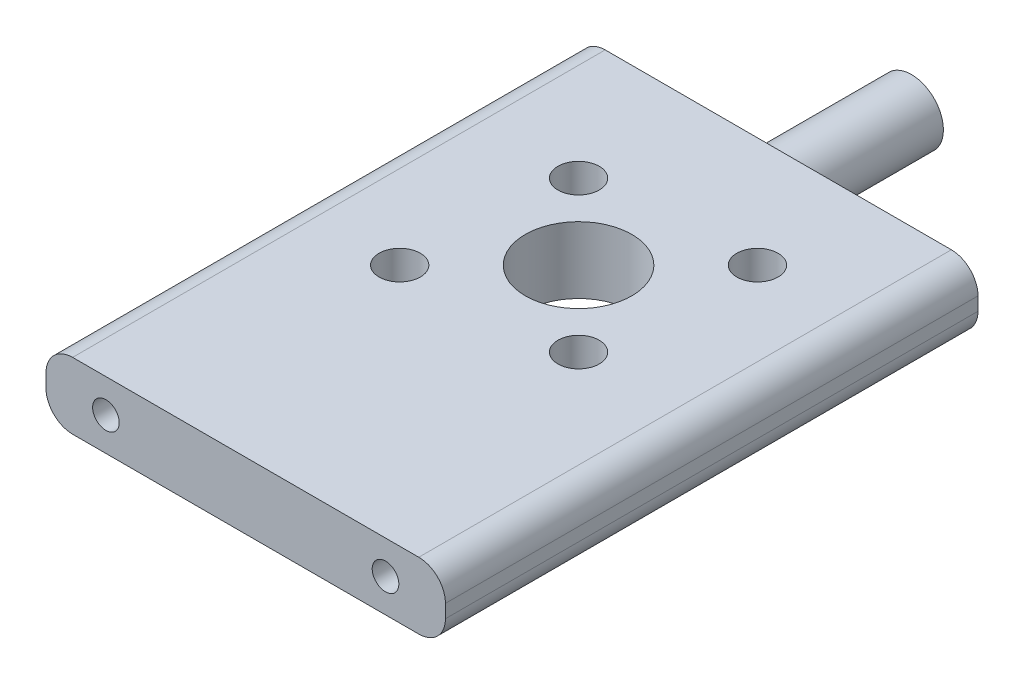
ISO-10303-21;
HEADER;
FILE_DESCRIPTION(('STEP AP214'),'2;1');
FILE_NAME('part.step','',(''),(''),'','','');
FILE_SCHEMA(('AUTOMOTIVE_DESIGN { 1 0 10303 214 1 1 1 1 }'));
ENDSEC;
DATA;
#1=APPLICATION_CONTEXT('core data for automotive mechanical design processes');
#2=APPLICATION_PROTOCOL_DEFINITION('international standard','automotive_design',2000,#1);
#3=PRODUCT_CONTEXT('',#1,'mechanical');
#4=PRODUCT('Part','Part','',(#3));
#5=PRODUCT_RELATED_PRODUCT_CATEGORY('part','',(#4));
#6=PRODUCT_DEFINITION_FORMATION('','',#4);
#7=PRODUCT_DEFINITION_CONTEXT('part definition',#1,'design');
#8=PRODUCT_DEFINITION('design','',#6,#7);
#9=PRODUCT_DEFINITION_SHAPE('','',#8);
#10=(LENGTH_UNIT() NAMED_UNIT(*) SI_UNIT(.MILLI.,.METRE.));
#11=(NAMED_UNIT(*) PLANE_ANGLE_UNIT() SI_UNIT($,.RADIAN.));
#12=(NAMED_UNIT(*) SI_UNIT($,.STERADIAN.) SOLID_ANGLE_UNIT());
#13=UNCERTAINTY_MEASURE_WITH_UNIT(LENGTH_MEASURE(1.E-05),#10,'distance_accuracy_value','');
#14=(GEOMETRIC_REPRESENTATION_CONTEXT(3) GLOBAL_UNCERTAINTY_ASSIGNED_CONTEXT((#13)) GLOBAL_UNIT_ASSIGNED_CONTEXT((#10,
#11,#12)) REPRESENTATION_CONTEXT('',''));
#15=CARTESIAN_POINT('',(0.,0.,0.));
#16=DIRECTION('',(0.,0.,1.));
#17=DIRECTION('',(1.,0.,0.));
#18=AXIS2_PLACEMENT_3D('',#15,#16,#17);
#19=CARTESIAN_POINT('',(22.6874179769715,5.,-26.1944918881506));
#20=DIRECTION('',(0.,0.,1.));
#21=DIRECTION('',(1.,0.,0.));
#22=AXIS2_PLACEMENT_3D('',#19,#20,#21);
#23=PLANE('',#22);
#24=DIRECTION('',(0.,-1.,0.));
#25=VECTOR('',#24,1.);
#26=CARTESIAN_POINT('',(22.6874179769715,5.,-26.1944918881506));
#27=LINE('',#26,#25);
#28=CARTESIAN_POINT('',(22.6874179769715,3.,-26.1944918881506));
#29=VERTEX_POINT('',#28);
#30=CARTESIAN_POINT('',(22.6874179769715,2.,-26.1944918881506));
#31=VERTEX_POINT('',#30);
#32=EDGE_CURVE('E103',#29,#31,#27,.T.);
#33=ORIENTED_EDGE('',*,*,#32,.T.);
#34=CARTESIAN_POINT('',(20.6874179769715,2.,-26.1944918881506));
#35=DIRECTION('',(0.,0.,1.));
#36=DIRECTION('',(1.,0.,0.));
#37=AXIS2_PLACEMENT_3D('',#34,#35,#36);
#38=CIRCLE('',#37,2.);
#39=CARTESIAN_POINT('',(20.6874179769715,0.,-26.1944918881506));
#40=VERTEX_POINT('',#39);
#41=EDGE_CURVE('E133',#31,#40,#38,.F.);
#42=ORIENTED_EDGE('',*,*,#41,.T.);
#43=DIRECTION('',(-1.,0.,0.));
#44=VECTOR('',#43,1.);
#45=CARTESIAN_POINT('',(22.6874179769715,0.,-26.1944918881506));
#46=LINE('',#45,#44);
#47=CARTESIAN_POINT('',(-5.31258202302848,0.,-26.1944918881506));
#48=VERTEX_POINT('',#47);
#49=EDGE_CURVE('E165',#40,#48,#46,.T.);
#50=ORIENTED_EDGE('',*,*,#49,.T.);
#51=CARTESIAN_POINT('',(-5.31258202302848,2.,-26.1944918881506));
#52=DIRECTION('',(0.,0.,1.));
#53=DIRECTION('',(1.,0.,0.));
#54=AXIS2_PLACEMENT_3D('',#51,#52,#53);
#55=CIRCLE('',#54,2.);
#56=CARTESIAN_POINT('',(-7.31258202302848,2.,-26.1944918881506));
#57=VERTEX_POINT('',#56);
#58=EDGE_CURVE('E109',#48,#57,#55,.F.);
#59=ORIENTED_EDGE('',*,*,#58,.T.);
#60=DIRECTION('',(0.,-1.,0.));
#61=VECTOR('',#60,1.);
#62=CARTESIAN_POINT('',(-7.31258202302848,5.,-26.1944918881506));
#63=LINE('',#62,#61);
#64=CARTESIAN_POINT('',(-7.31258202302848,3.,-26.1944918881506));
#65=VERTEX_POINT('',#64);
#66=EDGE_CURVE('E121',#65,#57,#63,.T.);
#67=ORIENTED_EDGE('',*,*,#66,.F.);
#68=CARTESIAN_POINT('',(-5.31258202302848,3.,-26.1944918881506));
#69=DIRECTION('',(0.,0.,1.));
#70=DIRECTION('',(1.,0.,0.));
#71=AXIS2_PLACEMENT_3D('',#68,#69,#70);
#72=CIRCLE('',#71,2.);
#73=CARTESIAN_POINT('',(-5.31258202302848,5.,-26.1944918881506));
#74=VERTEX_POINT('',#73);
#75=EDGE_CURVE('E110',#65,#74,#72,.F.);
#76=ORIENTED_EDGE('',*,*,#75,.T.);
#77=DIRECTION('',(-1.,0.,0.));
#78=VECTOR('',#77,1.);
#79=CARTESIAN_POINT('',(22.6874179769715,5.,-26.1944918881506));
#80=LINE('',#79,#78);
#81=CARTESIAN_POINT('',(20.6874179769715,5.,-26.1944918881506));
#82=VERTEX_POINT('',#81);
#83=EDGE_CURVE('E105',#82,#74,#80,.T.);
#84=ORIENTED_EDGE('',*,*,#83,.F.);
#85=CARTESIAN_POINT('',(20.6874179769715,3.,-26.1944918881506));
#86=DIRECTION('',(0.,0.,1.));
#87=DIRECTION('',(1.,0.,0.));
#88=AXIS2_PLACEMENT_3D('',#85,#86,#87);
#89=CIRCLE('',#88,2.);
#90=EDGE_CURVE('E100',#82,#29,#89,.F.);
#91=ORIENTED_EDGE('',*,*,#90,.T.);
#92=EDGE_LOOP('',(#33,#42,#50,#59,#67,#76,#84,#91));
#93=FACE_BOUND('',#92,.T.);
#94=CARTESIAN_POINT('',(7.68741797697152,2.5,-26.1944918881506));
#95=DIRECTION('',(0.,0.,1.));
#96=DIRECTION('',(1.,0.,0.));
#97=AXIS2_PLACEMENT_3D('',#94,#95,#96);
#98=CIRCLE('',#97,2.4);
#99=CARTESIAN_POINT('',(10.0874179769715,2.5,-26.1944918881506));
#100=VERTEX_POINT('',#99);
#101=EDGE_CURVE('E120',#100,#100,#98,.F.);
#102=ORIENTED_EDGE('',*,*,#101,.F.);
#103=EDGE_LOOP('',(#102));
#104=FACE_BOUND('',#103,.T.);
#105=ADVANCED_FACE('F33',(#93,#104),#23,.F.);
#106=CARTESIAN_POINT('',(22.6874179769715,5.,13.8055081118494));
#107=DIRECTION('',(-1.,0.,0.));
#108=DIRECTION('',(0.,0.,1.));
#109=AXIS2_PLACEMENT_3D('',#106,#107,#108);
#110=PLANE('',#109);
#111=DIRECTION('',(0.,-1.,0.));
#112=VECTOR('',#111,1.);
#113=CARTESIAN_POINT('',(22.6874179769715,5.,13.8055081118494));
#114=LINE('',#113,#112);
#115=CARTESIAN_POINT('',(22.6874179769715,3.,13.8055081118494));
#116=VERTEX_POINT('',#115);
#117=CARTESIAN_POINT('',(22.6874179769715,2.,13.8055081118494));
#118=VERTEX_POINT('',#117);
#119=EDGE_CURVE('E157',#116,#118,#114,.T.);
#120=ORIENTED_EDGE('',*,*,#119,.T.);
#121=DIRECTION('',(0.,0.,-1.));
#122=VECTOR('',#121,1.);
#123=CARTESIAN_POINT('',(22.6874179769715,2.,13.8055081118494));
#124=LINE('',#123,#122);
#125=EDGE_CURVE('E119',#118,#31,#124,.T.);
#126=ORIENTED_EDGE('',*,*,#125,.T.);
#127=ORIENTED_EDGE('',*,*,#32,.F.);
#128=DIRECTION('',(0.,0.,-1.));
#129=VECTOR('',#128,1.);
#130=CARTESIAN_POINT('',(22.6874179769715,3.,13.8055081118494));
#131=LINE('',#130,#129);
#132=EDGE_CURVE('E116',#29,#116,#131,.F.);
#133=ORIENTED_EDGE('',*,*,#132,.T.);
#134=EDGE_LOOP('',(#120,#126,#127,#133));
#135=FACE_BOUND('',#134,.T.);
#136=ADVANCED_FACE('F115',(#135),#110,.F.);
#137=CARTESIAN_POINT('',(-7.31258202302848,5.,13.8055081118494));
#138=DIRECTION('',(1.,0.,0.));
#139=DIRECTION('',(0.,0.,-1.));
#140=AXIS2_PLACEMENT_3D('',#137,#138,#139);
#141=PLANE('',#140);
#142=ORIENTED_EDGE('',*,*,#66,.T.);
#143=DIRECTION('',(0.,0.,1.));
#144=VECTOR('',#143,1.);
#145=CARTESIAN_POINT('',(-7.31258202302848,2.,13.8055081118494));
#146=LINE('',#145,#144);
#147=CARTESIAN_POINT('',(-7.31258202302848,2.,13.8055081118494));
#148=VERTEX_POINT('',#147);
#149=EDGE_CURVE('E146',#57,#148,#146,.T.);
#150=ORIENTED_EDGE('',*,*,#149,.T.);
#151=DIRECTION('',(0.,-1.,0.));
#152=VECTOR('',#151,1.);
#153=CARTESIAN_POINT('',(-7.31258202302848,5.,13.8055081118494));
#154=LINE('',#153,#152);
#155=CARTESIAN_POINT('',(-7.31258202302848,3.,13.8055081118494));
#156=VERTEX_POINT('',#155);
#157=EDGE_CURVE('E159',#156,#148,#154,.T.);
#158=ORIENTED_EDGE('',*,*,#157,.F.);
#159=DIRECTION('',(0.,0.,1.));
#160=VECTOR('',#159,1.);
#161=CARTESIAN_POINT('',(-7.31258202302848,3.,-26.1944918881506));
#162=LINE('',#161,#160);
#163=EDGE_CURVE('E144',#156,#65,#162,.F.);
#164=ORIENTED_EDGE('',*,*,#163,.T.);
#165=EDGE_LOOP('',(#142,#150,#158,#164));
#166=FACE_BOUND('',#165,.T.);
#167=ADVANCED_FACE('F174',(#166),#141,.F.);
#168=CARTESIAN_POINT('',(22.6874179769715,5.,13.8055081118494));
#169=DIRECTION('',(0.,0.,-1.));
#170=DIRECTION('',(-1.,0.,0.));
#171=AXIS2_PLACEMENT_3D('',#168,#169,#170);
#172=PLANE('',#171);
#173=CARTESIAN_POINT('',(18.1874179769715,2.5,13.8055081118494));
#174=DIRECTION('',(0.,0.,1.));
#175=DIRECTION('',(1.,0.,0.));
#176=AXIS2_PLACEMENT_3D('',#173,#174,#175);
#177=CIRCLE('',#176,1.);
#178=CARTESIAN_POINT('',(19.1874179769715,2.5,13.8055081118494));
#179=VERTEX_POINT('',#178);
#180=EDGE_CURVE('E380',#179,#179,#177,.T.);
#181=ORIENTED_EDGE('',*,*,#180,.F.);
#182=EDGE_LOOP('',(#181));
#183=FACE_BOUND('',#182,.T.);
#184=CARTESIAN_POINT('',(-2.81258202302848,2.5,13.8055081118494));
#185=DIRECTION('',(0.,0.,1.));
#186=DIRECTION('',(1.,0.,0.));
#187=AXIS2_PLACEMENT_3D('',#184,#185,#186);
#188=CIRCLE('',#187,1.);
#189=CARTESIAN_POINT('',(-1.81258202302848,2.5,13.8055081118494));
#190=VERTEX_POINT('',#189);
#191=EDGE_CURVE('E383',#190,#190,#188,.T.);
#192=ORIENTED_EDGE('',*,*,#191,.F.);
#193=EDGE_LOOP('',(#192));
#194=FACE_BOUND('',#193,.T.);
#195=DIRECTION('',(1.,0.,0.));
#196=VECTOR('',#195,1.);
#197=CARTESIAN_POINT('',(22.6874179769715,0.,13.8055081118494));
#198=LINE('',#197,#196);
#199=CARTESIAN_POINT('',(-5.31258202302848,0.,13.8055081118494));
#200=VERTEX_POINT('',#199);
#201=CARTESIAN_POINT('',(20.6874179769715,0.,13.8055081118494));
#202=VERTEX_POINT('',#201);
#203=EDGE_CURVE('E161',#200,#202,#198,.T.);
#204=ORIENTED_EDGE('',*,*,#203,.T.);
#205=CARTESIAN_POINT('',(20.6874179769715,2.,13.8055081118494));
#206=DIRECTION('',(0.,0.,-1.));
#207=DIRECTION('',(-1.,0.,0.));
#208=AXIS2_PLACEMENT_3D('',#205,#206,#207);
#209=CIRCLE('',#208,2.);
#210=EDGE_CURVE('E142',#202,#118,#209,.F.);
#211=ORIENTED_EDGE('',*,*,#210,.T.);
#212=ORIENTED_EDGE('',*,*,#119,.F.);
#213=CARTESIAN_POINT('',(20.6874179769715,3.,13.8055081118494));
#214=DIRECTION('',(0.,0.,-1.));
#215=DIRECTION('',(-1.,0.,0.));
#216=AXIS2_PLACEMENT_3D('',#213,#214,#215);
#217=CIRCLE('',#216,2.);
#218=CARTESIAN_POINT('',(20.6874179769715,5.,13.8055081118494));
#219=VERTEX_POINT('',#218);
#220=EDGE_CURVE('E125',#116,#219,#217,.F.);
#221=ORIENTED_EDGE('',*,*,#220,.T.);
#222=DIRECTION('',(1.,0.,0.));
#223=VECTOR('',#222,1.);
#224=CARTESIAN_POINT('',(22.6874179769715,5.,13.8055081118494));
#225=LINE('',#224,#223);
#226=CARTESIAN_POINT('',(-5.31258202302848,5.,13.8055081118494));
#227=VERTEX_POINT('',#226);
#228=EDGE_CURVE('E152',#227,#219,#225,.T.);
#229=ORIENTED_EDGE('',*,*,#228,.F.);
#230=CARTESIAN_POINT('',(-5.31258202302848,3.,13.8055081118494));
#231=DIRECTION('',(0.,0.,-1.));
#232=DIRECTION('',(-1.,0.,0.));
#233=AXIS2_PLACEMENT_3D('',#230,#231,#232);
#234=CIRCLE('',#233,2.);
#235=EDGE_CURVE('E56',#227,#156,#234,.F.);
#236=ORIENTED_EDGE('',*,*,#235,.T.);
#237=ORIENTED_EDGE('',*,*,#157,.T.);
#238=CARTESIAN_POINT('',(-5.31258202302848,2.,13.8055081118494));
#239=DIRECTION('',(0.,0.,-1.));
#240=DIRECTION('',(-1.,0.,0.));
#241=AXIS2_PLACEMENT_3D('',#238,#239,#240);
#242=CIRCLE('',#241,2.);
#243=EDGE_CURVE('E48',#148,#200,#242,.F.);
#244=ORIENTED_EDGE('',*,*,#243,.T.);
#245=EDGE_LOOP('',(#204,#211,#212,#221,#229,#236,#237,#244));
#246=FACE_BOUND('',#245,.T.);
#247=ADVANCED_FACE('F156',(#183,#194,#246),#172,.F.);
#248=CARTESIAN_POINT('',(0.,5.,0.));
#249=DIRECTION('',(0.,1.,0.));
#250=DIRECTION('',(0.,0.,1.));
#251=AXIS2_PLACEMENT_3D('',#248,#249,#250);
#252=PLANE('',#251);
#253=CARTESIAN_POINT('',(0.969903555699315,5.,-4.47697746687841));
#254=DIRECTION('',(0.,1.,0.));
#255=DIRECTION('',(0.,0.,1.));
#256=AXIS2_PLACEMENT_3D('',#253,#254,#255);
#257=CIRCLE('',#256,1.55);
#258=CARTESIAN_POINT('',(0.969903555699315,5.,-2.92697746687841));
#259=VERTEX_POINT('',#258);
#260=EDGE_CURVE('E389',#259,#259,#257,.T.);
#261=ORIENTED_EDGE('',*,*,#260,.F.);
#262=EDGE_LOOP('',(#261));
#263=FACE_BOUND('',#262,.T.);
#264=CARTESIAN_POINT('',(13.3442722264639,5.,-5.53763763865823));
#265=DIRECTION('',(0.,1.,0.));
#266=DIRECTION('',(0.,0.,1.));
#267=AXIS2_PLACEMENT_3D('',#264,#265,#266);
#268=CIRCLE('',#267,1.55);
#269=CARTESIAN_POINT('',(13.3442722264639,5.,-3.98763763865823));
#270=VERTEX_POINT('',#269);
#271=EDGE_CURVE('E398',#270,#270,#268,.T.);
#272=ORIENTED_EDGE('',*,*,#271,.F.);
#273=EDGE_LOOP('',(#272));
#274=FACE_BOUND('',#273,.T.);
#275=CARTESIAN_POINT('',(14.4049323982437,5.,-17.9120063094228));
#276=DIRECTION('',(0.,1.,0.));
#277=DIRECTION('',(0.,0.,1.));
#278=AXIS2_PLACEMENT_3D('',#275,#276,#277);
#279=CIRCLE('',#278,1.55);
#280=CARTESIAN_POINT('',(14.4049323982437,5.,-16.3620063094228));
#281=VERTEX_POINT('',#280);
#282=EDGE_CURVE('E404',#281,#281,#279,.T.);
#283=ORIENTED_EDGE('',*,*,#282,.F.);
#284=EDGE_LOOP('',(#283));
#285=FACE_BOUND('',#284,.T.);
#286=CARTESIAN_POINT('',(2.03056372747914,5.,-16.851346137643));
#287=DIRECTION('',(0.,1.,0.));
#288=DIRECTION('',(0.,0.,1.));
#289=AXIS2_PLACEMENT_3D('',#286,#287,#288);
#290=CIRCLE('',#289,1.55);
#291=CARTESIAN_POINT('',(2.03056372747914,5.,-15.301346137643));
#292=VERTEX_POINT('',#291);
#293=EDGE_CURVE('E410',#292,#292,#290,.T.);
#294=ORIENTED_EDGE('',*,*,#293,.F.);
#295=EDGE_LOOP('',(#294));
#296=FACE_BOUND('',#295,.T.);
#297=CARTESIAN_POINT('',(7.68741797697152,5.,-11.1944918881506));
#298=DIRECTION('',(0.,1.,0.));
#299=DIRECTION('',(0.,0.,1.));
#300=AXIS2_PLACEMENT_3D('',#297,#298,#299);
#301=CIRCLE('',#300,4.);
#302=CARTESIAN_POINT('',(7.68741797697152,5.,-7.19449188815061));
#303=VERTEX_POINT('',#302);
#304=EDGE_CURVE('E416',#303,#303,#301,.T.);
#305=ORIENTED_EDGE('',*,*,#304,.F.);
#306=EDGE_LOOP('',(#305));
#307=FACE_BOUND('',#306,.T.);
#308=ORIENTED_EDGE('',*,*,#228,.T.);
#309=DIRECTION('',(0.,0.,-1.));
#310=VECTOR('',#309,1.);
#311=CARTESIAN_POINT('',(20.6874179769715,5.,-26.1944918881506));
#312=LINE('',#311,#310);
#313=EDGE_CURVE('E11',#219,#82,#312,.T.);
#314=ORIENTED_EDGE('',*,*,#313,.T.);
#315=ORIENTED_EDGE('',*,*,#83,.T.);
#316=DIRECTION('',(0.,0.,1.));
#317=VECTOR('',#316,1.);
#318=CARTESIAN_POINT('',(-5.31258202302848,5.,13.8055081118494));
#319=LINE('',#318,#317);
#320=EDGE_CURVE('E41',#74,#227,#319,.T.);
#321=ORIENTED_EDGE('',*,*,#320,.T.);
#322=EDGE_LOOP('',(#308,#314,#315,#321));
#323=FACE_BOUND('',#322,.T.);
#324=ADVANCED_FACE('F151',(#263,#274,#285,#296,#307,#323),#252,.T.);
#325=CARTESIAN_POINT('',(0.,0.,0.));
#326=DIRECTION('',(0.,1.,0.));
#327=DIRECTION('',(0.,0.,1.));
#328=AXIS2_PLACEMENT_3D('',#325,#326,#327);
#329=PLANE('',#328);
#330=CARTESIAN_POINT('',(0.969903555699315,0.,-4.47697746687841));
#331=DIRECTION('',(0.,1.,0.));
#332=DIRECTION('',(0.,0.,1.));
#333=AXIS2_PLACEMENT_3D('',#330,#331,#332);
#334=CIRCLE('',#333,1.55);
#335=CARTESIAN_POINT('',(0.969903555699315,0.,-2.92697746687841));
#336=VERTEX_POINT('',#335);
#337=EDGE_CURVE('E395',#336,#336,#334,.T.);
#338=ORIENTED_EDGE('',*,*,#337,.T.);
#339=EDGE_LOOP('',(#338));
#340=FACE_BOUND('',#339,.T.);
#341=CARTESIAN_POINT('',(13.3442722264639,0.,-5.53763763865823));
#342=DIRECTION('',(0.,1.,0.));
#343=DIRECTION('',(0.,0.,1.));
#344=AXIS2_PLACEMENT_3D('',#341,#342,#343);
#345=CIRCLE('',#344,1.55);
#346=CARTESIAN_POINT('',(13.3442722264639,0.,-3.98763763865823));
#347=VERTEX_POINT('',#346);
#348=EDGE_CURVE('E401',#347,#347,#345,.T.);
#349=ORIENTED_EDGE('',*,*,#348,.T.);
#350=EDGE_LOOP('',(#349));
#351=FACE_BOUND('',#350,.T.);
#352=CARTESIAN_POINT('',(14.4049323982437,0.,-17.9120063094228));
#353=DIRECTION('',(0.,1.,0.));
#354=DIRECTION('',(0.,0.,1.));
#355=AXIS2_PLACEMENT_3D('',#352,#353,#354);
#356=CIRCLE('',#355,1.55);
#357=CARTESIAN_POINT('',(14.4049323982437,0.,-16.3620063094228));
#358=VERTEX_POINT('',#357);
#359=EDGE_CURVE('E407',#358,#358,#356,.T.);
#360=ORIENTED_EDGE('',*,*,#359,.T.);
#361=EDGE_LOOP('',(#360));
#362=FACE_BOUND('',#361,.T.);
#363=CARTESIAN_POINT('',(2.03056372747914,0.,-16.851346137643));
#364=DIRECTION('',(0.,1.,0.));
#365=DIRECTION('',(0.,0.,1.));
#366=AXIS2_PLACEMENT_3D('',#363,#364,#365);
#367=CIRCLE('',#366,1.55);
#368=CARTESIAN_POINT('',(2.03056372747914,0.,-15.301346137643));
#369=VERTEX_POINT('',#368);
#370=EDGE_CURVE('E413',#369,#369,#367,.T.);
#371=ORIENTED_EDGE('',*,*,#370,.T.);
#372=EDGE_LOOP('',(#371));
#373=FACE_BOUND('',#372,.T.);
#374=CARTESIAN_POINT('',(7.68741797697152,0.,-11.1944918881506));
#375=DIRECTION('',(0.,1.,0.));
#376=DIRECTION('',(0.,0.,1.));
#377=AXIS2_PLACEMENT_3D('',#374,#375,#376);
#378=CIRCLE('',#377,4.);
#379=CARTESIAN_POINT('',(7.68741797697152,0.,-7.19449188815061));
#380=VERTEX_POINT('',#379);
#381=EDGE_CURVE('E168',#380,#380,#378,.T.);
#382=ORIENTED_EDGE('',*,*,#381,.T.);
#383=EDGE_LOOP('',(#382));
#384=FACE_BOUND('',#383,.T.);
#385=ORIENTED_EDGE('',*,*,#49,.F.);
#386=DIRECTION('',(0.,0.,-1.));
#387=VECTOR('',#386,1.);
#388=CARTESIAN_POINT('',(20.6874179769715,0.,0.));
#389=LINE('',#388,#387);
#390=EDGE_CURVE('E137',#40,#202,#389,.F.);
#391=ORIENTED_EDGE('',*,*,#390,.T.);
#392=ORIENTED_EDGE('',*,*,#203,.F.);
#393=DIRECTION('',(0.,0.,1.));
#394=VECTOR('',#393,1.);
#395=CARTESIAN_POINT('',(-5.31258202302848,0.,0.));
#396=LINE('',#395,#394);
#397=EDGE_CURVE('E135',#200,#48,#396,.F.);
#398=ORIENTED_EDGE('',*,*,#397,.T.);
#399=EDGE_LOOP('',(#385,#391,#392,#398));
#400=FACE_BOUND('',#399,.T.);
#401=ADVANCED_FACE('F181',(#340,#351,#362,#373,#384,#400),#329,.F.);
#402=CARTESIAN_POINT('',(7.68741797697152,0.,-11.1944918881506));
#403=DIRECTION('',(0.,1.,0.));
#404=DIRECTION('',(0.,0.,1.));
#405=AXIS2_PLACEMENT_3D('',#402,#403,#404);
#406=CYLINDRICAL_SURFACE('',#405,4.);
#407=ORIENTED_EDGE('',*,*,#381,.F.);
#408=EDGE_LOOP('',(#407));
#409=FACE_BOUND('',#408,.T.);
#410=ORIENTED_EDGE('',*,*,#304,.T.);
#411=EDGE_LOOP('',(#410));
#412=FACE_BOUND('',#411,.T.);
#413=ADVANCED_FACE('F318',(#409,#412),#406,.F.);
#414=CARTESIAN_POINT('',(2.03056372747914,0.,-16.851346137643));
#415=DIRECTION('',(0.,1.,0.));
#416=DIRECTION('',(0.,0.,1.));
#417=AXIS2_PLACEMENT_3D('',#414,#415,#416);
#418=CYLINDRICAL_SURFACE('',#417,1.55);
#419=ORIENTED_EDGE('',*,*,#370,.F.);
#420=EDGE_LOOP('',(#419));
#421=FACE_BOUND('',#420,.T.);
#422=ORIENTED_EDGE('',*,*,#293,.T.);
#423=EDGE_LOOP('',(#422));
#424=FACE_BOUND('',#423,.T.);
#425=ADVANCED_FACE('F309',(#421,#424),#418,.F.);
#426=CARTESIAN_POINT('',(14.4049323982437,0.,-17.9120063094228));
#427=DIRECTION('',(0.,1.,0.));
#428=DIRECTION('',(0.,0.,1.));
#429=AXIS2_PLACEMENT_3D('',#426,#427,#428);
#430=CYLINDRICAL_SURFACE('',#429,1.55);
#431=ORIENTED_EDGE('',*,*,#359,.F.);
#432=EDGE_LOOP('',(#431));
#433=FACE_BOUND('',#432,.T.);
#434=ORIENTED_EDGE('',*,*,#282,.T.);
#435=EDGE_LOOP('',(#434));
#436=FACE_BOUND('',#435,.T.);
#437=ADVANCED_FACE('F300',(#433,#436),#430,.F.);
#438=CARTESIAN_POINT('',(13.3442722264639,0.,-5.53763763865823));
#439=DIRECTION('',(0.,1.,0.));
#440=DIRECTION('',(0.,0.,1.));
#441=AXIS2_PLACEMENT_3D('',#438,#439,#440);
#442=CYLINDRICAL_SURFACE('',#441,1.55);
#443=ORIENTED_EDGE('',*,*,#348,.F.);
#444=EDGE_LOOP('',(#443));
#445=FACE_BOUND('',#444,.T.);
#446=ORIENTED_EDGE('',*,*,#271,.T.);
#447=EDGE_LOOP('',(#446));
#448=FACE_BOUND('',#447,.T.);
#449=ADVANCED_FACE('F291',(#445,#448),#442,.F.);
#450=CARTESIAN_POINT('',(0.969903555699315,0.,-4.47697746687841));
#451=DIRECTION('',(0.,1.,0.));
#452=DIRECTION('',(0.,0.,1.));
#453=AXIS2_PLACEMENT_3D('',#450,#451,#452);
#454=CYLINDRICAL_SURFACE('',#453,1.55);
#455=ORIENTED_EDGE('',*,*,#337,.F.);
#456=EDGE_LOOP('',(#455));
#457=FACE_BOUND('',#456,.T.);
#458=ORIENTED_EDGE('',*,*,#260,.T.);
#459=EDGE_LOOP('',(#458));
#460=FACE_BOUND('',#459,.T.);
#461=ADVANCED_FACE('F282',(#457,#460),#454,.F.);
#462=CARTESIAN_POINT('',(-2.81258202302848,2.5,8.8055081118494));
#463=DIRECTION('',(0.,0.,1.));
#464=DIRECTION('',(1.,0.,0.));
#465=AXIS2_PLACEMENT_3D('',#462,#463,#464);
#466=CYLINDRICAL_SURFACE('',#465,1.);
#467=CARTESIAN_POINT('',(-2.81258202302848,2.5,8.8055081118494));
#468=DIRECTION('',(0.,0.,1.));
#469=DIRECTION('',(1.,0.,0.));
#470=AXIS2_PLACEMENT_3D('',#467,#468,#469);
#471=CIRCLE('',#470,1.);
#472=CARTESIAN_POINT('',(-1.81258202302848,2.5,8.8055081118494));
#473=VERTEX_POINT('',#472);
#474=EDGE_CURVE('E385',#473,#473,#471,.T.);
#475=ORIENTED_EDGE('',*,*,#474,.F.);
#476=EDGE_LOOP('',(#475));
#477=FACE_BOUND('',#476,.T.);
#478=ORIENTED_EDGE('',*,*,#191,.T.);
#479=EDGE_LOOP('',(#478));
#480=FACE_BOUND('',#479,.T.);
#481=ADVANCED_FACE('F273',(#477,#480),#466,.F.);
#482=CARTESIAN_POINT('',(-2.81258202302848,2.5,8.8055081118494));
#483=DIRECTION('',(0.,0.,1.));
#484=DIRECTION('',(1.,0.,0.));
#485=AXIS2_PLACEMENT_3D('',#482,#483,#484);
#486=PLANE('',#485);
#487=ORIENTED_EDGE('',*,*,#474,.T.);
#488=EDGE_LOOP('',(#487));
#489=FACE_BOUND('',#488,.T.);
#490=ADVANCED_FACE('F264',(#489),#486,.T.);
#491=CARTESIAN_POINT('',(18.1874179769715,2.5,8.8055081118494));
#492=DIRECTION('',(0.,0.,1.));
#493=DIRECTION('',(1.,0.,0.));
#494=AXIS2_PLACEMENT_3D('',#491,#492,#493);
#495=CYLINDRICAL_SURFACE('',#494,1.);
#496=CARTESIAN_POINT('',(18.1874179769715,2.5,8.8055081118494));
#497=DIRECTION('',(0.,0.,1.));
#498=DIRECTION('',(1.,0.,0.));
#499=AXIS2_PLACEMENT_3D('',#496,#497,#498);
#500=CIRCLE('',#499,1.);
#501=CARTESIAN_POINT('',(19.1874179769715,2.5,8.8055081118494));
#502=VERTEX_POINT('',#501);
#503=EDGE_CURVE('E386',#502,#502,#500,.T.);
#504=ORIENTED_EDGE('',*,*,#503,.F.);
#505=EDGE_LOOP('',(#504));
#506=FACE_BOUND('',#505,.T.);
#507=ORIENTED_EDGE('',*,*,#180,.T.);
#508=EDGE_LOOP('',(#507));
#509=FACE_BOUND('',#508,.T.);
#510=ADVANCED_FACE('F255',(#506,#509),#495,.F.);
#511=CARTESIAN_POINT('',(18.1874179769715,2.5,8.8055081118494));
#512=DIRECTION('',(0.,0.,1.));
#513=DIRECTION('',(1.,0.,0.));
#514=AXIS2_PLACEMENT_3D('',#511,#512,#513);
#515=PLANE('',#514);
#516=ORIENTED_EDGE('',*,*,#503,.T.);
#517=EDGE_LOOP('',(#516));
#518=FACE_BOUND('',#517,.T.);
#519=ADVANCED_FACE('F241',(#518),#515,.T.);
#520=CARTESIAN_POINT('',(7.68741797697152,2.5,-36.1944918881506));
#521=DIRECTION('',(0.,0.,1.));
#522=DIRECTION('',(1.,0.,0.));
#523=AXIS2_PLACEMENT_3D('',#520,#521,#522);
#524=CYLINDRICAL_SURFACE('',#523,2.4);
#525=CARTESIAN_POINT('',(7.68741797697152,2.5,-36.1944918881506));
#526=DIRECTION('',(0.,0.,-1.));
#527=DIRECTION('',(-1.,0.,0.));
#528=AXIS2_PLACEMENT_3D('',#525,#526,#527);
#529=CIRCLE('',#528,2.4);
#530=CARTESIAN_POINT('',(5.28741797697152,2.5,-36.1944918881506));
#531=VERTEX_POINT('',#530);
#532=EDGE_CURVE('E444',#531,#531,#529,.T.);
#533=ORIENTED_EDGE('',*,*,#532,.F.);
#534=EDGE_LOOP('',(#533));
#535=FACE_BOUND('',#534,.T.);
#536=ORIENTED_EDGE('',*,*,#101,.T.);
#537=EDGE_LOOP('',(#536));
#538=FACE_BOUND('',#537,.T.);
#539=ADVANCED_FACE('F232',(#535,#538),#524,.T.);
#540=CARTESIAN_POINT('',(7.68741797697152,2.5,-36.1944918881506));
#541=DIRECTION('',(0.,0.,-1.));
#542=DIRECTION('',(-1.,0.,0.));
#543=AXIS2_PLACEMENT_3D('',#540,#541,#542);
#544=PLANE('',#543);
#545=ORIENTED_EDGE('',*,*,#532,.T.);
#546=EDGE_LOOP('',(#545));
#547=FACE_BOUND('',#546,.T.);
#548=ADVANCED_FACE('F201',(#547),#544,.T.);
#549=CARTESIAN_POINT('',(20.6874179769715,2.,13.8055081118494));
#550=DIRECTION('',(0.,0.,-1.));
#551=DIRECTION('',(-1.,0.,0.));
#552=AXIS2_PLACEMENT_3D('',#549,#550,#551);
#553=CYLINDRICAL_SURFACE('',#552,2.);
#554=ORIENTED_EDGE('',*,*,#210,.F.);
#555=ORIENTED_EDGE('',*,*,#390,.F.);
#556=ORIENTED_EDGE('',*,*,#41,.F.);
#557=ORIENTED_EDGE('',*,*,#125,.F.);
#558=EDGE_LOOP('',(#554,#555,#556,#557));
#559=FACE_BOUND('',#558,.T.);
#560=ADVANCED_FACE('F185',(#559),#553,.T.);
#561=CARTESIAN_POINT('',(-5.31258202302848,2.,13.8055081118494));
#562=DIRECTION('',(0.,0.,1.));
#563=DIRECTION('',(1.,0.,0.));
#564=AXIS2_PLACEMENT_3D('',#561,#562,#563);
#565=CYLINDRICAL_SURFACE('',#564,2.);
#566=ORIENTED_EDGE('',*,*,#58,.F.);
#567=ORIENTED_EDGE('',*,*,#397,.F.);
#568=ORIENTED_EDGE('',*,*,#243,.F.);
#569=ORIENTED_EDGE('',*,*,#149,.F.);
#570=EDGE_LOOP('',(#566,#567,#568,#569));
#571=FACE_BOUND('',#570,.T.);
#572=ADVANCED_FACE('F177',(#571),#565,.T.);
#573=CARTESIAN_POINT('',(20.6874179769715,3.,0.));
#574=DIRECTION('',(0.,0.,1.));
#575=DIRECTION('',(1.,0.,0.));
#576=AXIS2_PLACEMENT_3D('',#573,#574,#575);
#577=CYLINDRICAL_SURFACE('',#576,2.);
#578=ORIENTED_EDGE('',*,*,#220,.F.);
#579=ORIENTED_EDGE('',*,*,#132,.F.);
#580=ORIENTED_EDGE('',*,*,#90,.F.);
#581=ORIENTED_EDGE('',*,*,#313,.F.);
#582=EDGE_LOOP('',(#578,#579,#580,#581));
#583=FACE_BOUND('',#582,.T.);
#584=ADVANCED_FACE('F124',(#583),#577,.T.);
#585=CARTESIAN_POINT('',(-5.31258202302848,3.,0.));
#586=DIRECTION('',(0.,0.,-1.));
#587=DIRECTION('',(-1.,0.,0.));
#588=AXIS2_PLACEMENT_3D('',#585,#586,#587);
#589=CYLINDRICAL_SURFACE('',#588,2.);
#590=ORIENTED_EDGE('',*,*,#75,.F.);
#591=ORIENTED_EDGE('',*,*,#163,.F.);
#592=ORIENTED_EDGE('',*,*,#235,.F.);
#593=ORIENTED_EDGE('',*,*,#320,.F.);
#594=EDGE_LOOP('',(#590,#591,#592,#593));
#595=FACE_BOUND('',#594,.T.);
#596=ADVANCED_FACE('F35',(#595),#589,.T.);
#597=CLOSED_SHELL('',(#105,#136,#167,#247,#324,#401,#413,#425,#437,#449,#461,#481,#490,#510,
#519,#539,#548,#560,#572,#584,#596));
#598=MANIFOLD_SOLID_BREP('B2',#597);
#599=ADVANCED_BREP_SHAPE_REPRESENTATION('',(#18,#598),#14);
#600=SHAPE_DEFINITION_REPRESENTATION(#9,#599);
ENDSEC;
END-ISO-10303-21;
